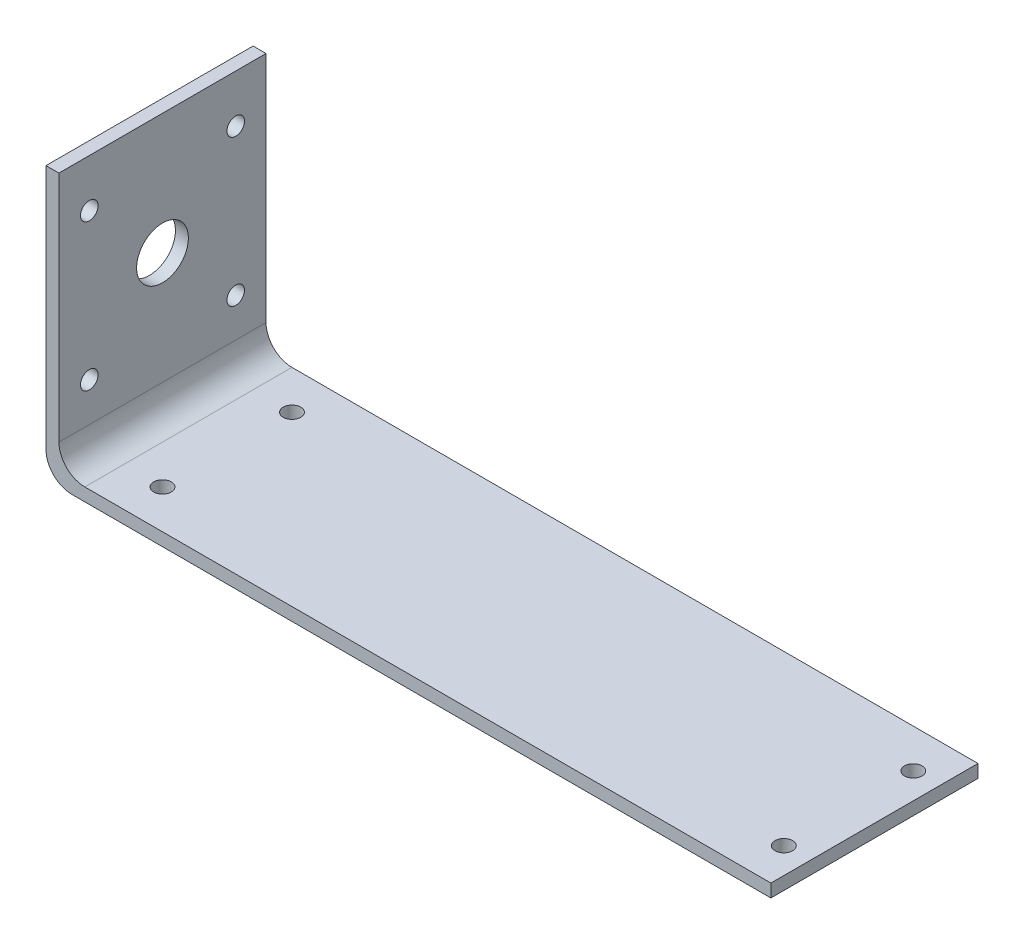
ISO-10303-21;
HEADER;
FILE_DESCRIPTION(('STEP AP214'),'2;1');
FILE_NAME('part.step','',(''),(''),'','','');
FILE_SCHEMA(('AUTOMOTIVE_DESIGN { 1 0 10303 214 1 1 1 1 }'));
ENDSEC;
DATA;
#1=APPLICATION_CONTEXT('core data for automotive mechanical design processes');
#2=APPLICATION_PROTOCOL_DEFINITION('international standard','automotive_design',2000,#1);
#3=PRODUCT_CONTEXT('',#1,'mechanical');
#4=PRODUCT('Part','Part','',(#3));
#5=PRODUCT_RELATED_PRODUCT_CATEGORY('part','',(#4));
#6=PRODUCT_DEFINITION_FORMATION('','',#4);
#7=PRODUCT_DEFINITION_CONTEXT('part definition',#1,'design');
#8=PRODUCT_DEFINITION('design','',#6,#7);
#9=PRODUCT_DEFINITION_SHAPE('','',#8);
#10=(LENGTH_UNIT() NAMED_UNIT(*) SI_UNIT(.MILLI.,.METRE.));
#11=(NAMED_UNIT(*) PLANE_ANGLE_UNIT() SI_UNIT($,.RADIAN.));
#12=(NAMED_UNIT(*) SI_UNIT($,.STERADIAN.) SOLID_ANGLE_UNIT());
#13=UNCERTAINTY_MEASURE_WITH_UNIT(LENGTH_MEASURE(1.E-05),#10,'distance_accuracy_value','');
#14=(GEOMETRIC_REPRESENTATION_CONTEXT(3) GLOBAL_UNCERTAINTY_ASSIGNED_CONTEXT((#13)) GLOBAL_UNIT_ASSIGNED_CONTEXT((#10,
#11,#12)) REPRESENTATION_CONTEXT('',''));
#15=CARTESIAN_POINT('',(0.,0.,0.));
#16=DIRECTION('',(0.,0.,1.));
#17=DIRECTION('',(1.,0.,0.));
#18=AXIS2_PLACEMENT_3D('',#15,#16,#17);
#19=CARTESIAN_POINT('',(0.,0.,0.));
#20=DIRECTION('',(0.,-1.,0.));
#21=DIRECTION('',(0.,0.,-1.));
#22=AXIS2_PLACEMENT_3D('',#19,#20,#21);
#23=PLANE('',#22);
#24=DIRECTION('',(1.,0.,0.));
#25=VECTOR('',#24,1.);
#26=CARTESIAN_POINT('',(-88.9,0.,25.4));
#27=LINE('',#26,#25);
#28=CARTESIAN_POINT('',(-82.55,0.,25.4));
#29=VERTEX_POINT('',#28);
#30=CARTESIAN_POINT('',(88.9,0.,25.4));
#31=VERTEX_POINT('',#30);
#32=EDGE_CURVE('E140',#29,#31,#27,.T.);
#33=ORIENTED_EDGE('',*,*,#32,.F.);
#34=DIRECTION('',(0.,0.,1.));
#35=VECTOR('',#34,1.);
#36=CARTESIAN_POINT('',(-82.55,0.,-25.4));
#37=LINE('',#36,#35);
#38=CARTESIAN_POINT('',(-82.55,0.,-25.4));
#39=VERTEX_POINT('',#38);
#40=EDGE_CURVE('E159',#29,#39,#37,.F.);
#41=ORIENTED_EDGE('',*,*,#40,.T.);
#42=DIRECTION('',(-1.,0.,0.));
#43=VECTOR('',#42,1.);
#44=CARTESIAN_POINT('',(-88.9,0.,-25.4));
#45=LINE('',#44,#43);
#46=CARTESIAN_POINT('',(88.9,0.,-25.4));
#47=VERTEX_POINT('',#46);
#48=EDGE_CURVE('E146',#47,#39,#45,.T.);
#49=ORIENTED_EDGE('',*,*,#48,.F.);
#50=DIRECTION('',(0.,0.,-1.));
#51=VECTOR('',#50,1.);
#52=CARTESIAN_POINT('',(88.9,0.,25.4));
#53=LINE('',#52,#51);
#54=EDGE_CURVE('E135',#31,#47,#53,.T.);
#55=ORIENTED_EDGE('',*,*,#54,.F.);
#56=EDGE_LOOP('',(#33,#41,#49,#55));
#57=FACE_BOUND('',#56,.T.);
#58=CARTESIAN_POINT('',(-69.85,0.,15.875));
#59=DIRECTION('',(0.,1.,0.));
#60=DIRECTION('',(0.,0.,1.));
#61=AXIS2_PLACEMENT_3D('',#58,#59,#60);
#62=CIRCLE('',#61,2.15899999999999);
#63=CARTESIAN_POINT('',(-69.85,0.,18.034));
#64=VERTEX_POINT('',#63);
#65=EDGE_CURVE('E277',#64,#64,#62,.T.);
#66=ORIENTED_EDGE('',*,*,#65,.T.);
#67=EDGE_LOOP('',(#66));
#68=FACE_BOUND('',#67,.T.);
#69=CARTESIAN_POINT('',(-69.85,0.,-15.875));
#70=DIRECTION('',(0.,1.,0.));
#71=DIRECTION('',(0.,0.,1.));
#72=AXIS2_PLACEMENT_3D('',#69,#70,#71);
#73=CIRCLE('',#72,2.15899999999999);
#74=CARTESIAN_POINT('',(-69.85,0.,-13.716));
#75=VERTEX_POINT('',#74);
#76=EDGE_CURVE('E271',#75,#75,#73,.T.);
#77=ORIENTED_EDGE('',*,*,#76,.T.);
#78=EDGE_LOOP('',(#77));
#79=FACE_BOUND('',#78,.T.);
#80=CARTESIAN_POINT('',(82.55,0.,-15.875));
#81=DIRECTION('',(0.,1.,0.));
#82=DIRECTION('',(0.,0.,1.));
#83=AXIS2_PLACEMENT_3D('',#80,#81,#82);
#84=CIRCLE('',#83,2.15899999999999);
#85=CARTESIAN_POINT('',(82.55,0.,-13.716));
#86=VERTEX_POINT('',#85);
#87=EDGE_CURVE('E262',#86,#86,#84,.T.);
#88=ORIENTED_EDGE('',*,*,#87,.T.);
#89=EDGE_LOOP('',(#88));
#90=FACE_BOUND('',#89,.T.);
#91=CARTESIAN_POINT('',(82.55,0.,15.875));
#92=DIRECTION('',(0.,1.,0.));
#93=DIRECTION('',(0.,0.,1.));
#94=AXIS2_PLACEMENT_3D('',#91,#92,#93);
#95=CIRCLE('',#94,2.15899999999999);
#96=CARTESIAN_POINT('',(82.55,0.,18.034));
#97=VERTEX_POINT('',#96);
#98=EDGE_CURVE('E258',#97,#97,#95,.T.);
#99=ORIENTED_EDGE('',*,*,#98,.T.);
#100=EDGE_LOOP('',(#99));
#101=FACE_BOUND('',#100,.T.);
#102=ADVANCED_FACE('F32',(#57,#68,#79,#90,#101),#23,.T.);
#103=CARTESIAN_POINT('',(-88.9,3.175,25.4));
#104=DIRECTION('',(1.,0.,0.));
#105=DIRECTION('',(0.,0.,-1.));
#106=AXIS2_PLACEMENT_3D('',#103,#104,#105);
#107=PLANE('',#106);
#108=CARTESIAN_POINT('',(-88.9,37.0105122421383,3.01383015766099E-08));
#109=DIRECTION('',(-1.,0.,0.));
#110=DIRECTION('',(0.,0.,1.));
#111=AXIS2_PLACEMENT_3D('',#108,#109,#110);
#112=CIRCLE('',#111,6.34999999999997);
#113=CARTESIAN_POINT('',(-88.9,37.0105122421383,6.35000003013828));
#114=VERTEX_POINT('',#113);
#115=EDGE_CURVE('E283',#114,#114,#112,.T.);
#116=ORIENTED_EDGE('',*,*,#115,.F.);
#117=EDGE_LOOP('',(#116));
#118=FACE_BOUND('',#117,.T.);
#119=CARTESIAN_POINT('',(-88.9,54.9710244842767,-17.960512212));
#120=DIRECTION('',(-1.,0.,0.));
#121=DIRECTION('',(0.,0.,1.));
#122=AXIS2_PLACEMENT_3D('',#119,#120,#121);
#123=CIRCLE('',#122,2.15899999999997);
#124=CARTESIAN_POINT('',(-88.9,54.9710244842767,-15.801512212));
#125=VERTEX_POINT('',#124);
#126=EDGE_CURVE('E288',#125,#125,#123,.T.);
#127=ORIENTED_EDGE('',*,*,#126,.F.);
#128=EDGE_LOOP('',(#127));
#129=FACE_BOUND('',#128,.T.);
#130=CARTESIAN_POINT('',(-88.9,54.9710244842766,17.9605122722766));
#131=DIRECTION('',(-1.,0.,0.));
#132=DIRECTION('',(0.,0.,1.));
#133=AXIS2_PLACEMENT_3D('',#130,#131,#132);
#134=CIRCLE('',#133,2.15899999999997);
#135=CARTESIAN_POINT('',(-88.9,54.9710244842766,20.1195122722766));
#136=VERTEX_POINT('',#135);
#137=EDGE_CURVE('E291',#136,#136,#134,.T.);
#138=ORIENTED_EDGE('',*,*,#137,.F.);
#139=EDGE_LOOP('',(#138));
#140=FACE_BOUND('',#139,.T.);
#141=CARTESIAN_POINT('',(-88.9,19.05,-17.960512212));
#142=DIRECTION('',(-1.,0.,0.));
#143=DIRECTION('',(0.,0.,1.));
#144=AXIS2_PLACEMENT_3D('',#141,#142,#143);
#145=CIRCLE('',#144,2.15899999999997);
#146=CARTESIAN_POINT('',(-88.9,19.05,-15.801512212));
#147=VERTEX_POINT('',#146);
#148=EDGE_CURVE('E126',#147,#147,#145,.T.);
#149=ORIENTED_EDGE('',*,*,#148,.F.);
#150=EDGE_LOOP('',(#149));
#151=FACE_BOUND('',#150,.T.);
#152=DIRECTION('',(0.,-1.,0.));
#153=VECTOR('',#152,1.);
#154=CARTESIAN_POINT('',(-88.9,3.175,-25.4));
#155=LINE('',#154,#153);
#156=CARTESIAN_POINT('',(-88.9,66.675,-25.4));
#157=VERTEX_POINT('',#156);
#158=CARTESIAN_POINT('',(-88.9,6.35,-25.4));
#159=VERTEX_POINT('',#158);
#160=EDGE_CURVE('E107',#157,#159,#155,.T.);
#161=ORIENTED_EDGE('',*,*,#160,.T.);
#162=DIRECTION('',(0.,0.,1.));
#163=VECTOR('',#162,1.);
#164=CARTESIAN_POINT('',(-88.9,6.35,25.4));
#165=LINE('',#164,#163);
#166=CARTESIAN_POINT('',(-88.9,6.35,25.4));
#167=VERTEX_POINT('',#166);
#168=EDGE_CURVE('E105',#159,#167,#165,.T.);
#169=ORIENTED_EDGE('',*,*,#168,.T.);
#170=DIRECTION('',(0.,-1.,0.));
#171=VECTOR('',#170,1.);
#172=CARTESIAN_POINT('',(-88.9,3.175,25.4));
#173=LINE('',#172,#171);
#174=CARTESIAN_POINT('',(-88.9,66.675,25.4));
#175=VERTEX_POINT('',#174);
#176=EDGE_CURVE('E97',#175,#167,#173,.T.);
#177=ORIENTED_EDGE('',*,*,#176,.F.);
#178=DIRECTION('',(0.,0.,1.));
#179=VECTOR('',#178,1.);
#180=CARTESIAN_POINT('',(-88.9,66.675,-25.4));
#181=LINE('',#180,#179);
#182=EDGE_CURVE('E103',#157,#175,#181,.T.);
#183=ORIENTED_EDGE('',*,*,#182,.F.);
#184=EDGE_LOOP('',(#161,#169,#177,#183));
#185=FACE_BOUND('',#184,.T.);
#186=CARTESIAN_POINT('',(-88.9,19.05,17.9605122722766));
#187=DIRECTION('',(-1.,0.,0.));
#188=DIRECTION('',(0.,0.,1.));
#189=AXIS2_PLACEMENT_3D('',#186,#187,#188);
#190=CIRCLE('',#189,2.15899999999997);
#191=CARTESIAN_POINT('',(-88.9,19.05,20.1195122722766));
#192=VERTEX_POINT('',#191);
#193=EDGE_CURVE('E297',#192,#192,#190,.T.);
#194=ORIENTED_EDGE('',*,*,#193,.F.);
#195=EDGE_LOOP('',(#194));
#196=FACE_BOUND('',#195,.T.);
#197=ADVANCED_FACE('F100',(#118,#129,#140,#151,#185,#196),#107,.F.);
#198=CARTESIAN_POINT('',(0.,3.175,0.));
#199=DIRECTION('',(0.,-1.,0.));
#200=DIRECTION('',(0.,0.,-1.));
#201=AXIS2_PLACEMENT_3D('',#198,#199,#200);
#202=PLANE('',#201);
#203=CARTESIAN_POINT('',(82.55,3.175,15.875));
#204=DIRECTION('',(0.,1.,0.));
#205=DIRECTION('',(0.,0.,1.));
#206=AXIS2_PLACEMENT_3D('',#203,#204,#205);
#207=CIRCLE('',#206,2.15899999999999);
#208=CARTESIAN_POINT('',(82.55,3.175,18.034));
#209=VERTEX_POINT('',#208);
#210=EDGE_CURVE('E261',#209,#209,#207,.T.);
#211=ORIENTED_EDGE('',*,*,#210,.F.);
#212=EDGE_LOOP('',(#211));
#213=FACE_BOUND('',#212,.T.);
#214=CARTESIAN_POINT('',(82.55,3.175,-15.875));
#215=DIRECTION('',(0.,1.,0.));
#216=DIRECTION('',(0.,0.,1.));
#217=AXIS2_PLACEMENT_3D('',#214,#215,#216);
#218=CIRCLE('',#217,2.15899999999999);
#219=CARTESIAN_POINT('',(82.55,3.175,-13.716));
#220=VERTEX_POINT('',#219);
#221=EDGE_CURVE('E265',#220,#220,#218,.T.);
#222=ORIENTED_EDGE('',*,*,#221,.F.);
#223=EDGE_LOOP('',(#222));
#224=FACE_BOUND('',#223,.T.);
#225=CARTESIAN_POINT('',(-69.85,3.175,-15.875));
#226=DIRECTION('',(0.,1.,0.));
#227=DIRECTION('',(0.,0.,1.));
#228=AXIS2_PLACEMENT_3D('',#225,#226,#227);
#229=CIRCLE('',#228,2.15899999999999);
#230=CARTESIAN_POINT('',(-69.85,3.175,-13.716));
#231=VERTEX_POINT('',#230);
#232=EDGE_CURVE('E274',#231,#231,#229,.T.);
#233=ORIENTED_EDGE('',*,*,#232,.F.);
#234=EDGE_LOOP('',(#233));
#235=FACE_BOUND('',#234,.T.);
#236=CARTESIAN_POINT('',(-69.85,3.175,15.875));
#237=DIRECTION('',(0.,1.,0.));
#238=DIRECTION('',(0.,0.,1.));
#239=AXIS2_PLACEMENT_3D('',#236,#237,#238);
#240=CIRCLE('',#239,2.15899999999999);
#241=CARTESIAN_POINT('',(-69.85,3.175,18.034));
#242=VERTEX_POINT('',#241);
#243=EDGE_CURVE('E280',#242,#242,#240,.T.);
#244=ORIENTED_EDGE('',*,*,#243,.F.);
#245=EDGE_LOOP('',(#244));
#246=FACE_BOUND('',#245,.T.);
#247=DIRECTION('',(-1.,0.,0.));
#248=VECTOR('',#247,1.);
#249=CARTESIAN_POINT('',(-88.9,3.175,-25.4));
#250=LINE('',#249,#248);
#251=CARTESIAN_POINT('',(88.9,3.175,-25.4));
#252=VERTEX_POINT('',#251);
#253=CARTESIAN_POINT('',(-79.375,3.175,-25.4));
#254=VERTEX_POINT('',#253);
#255=EDGE_CURVE('E139',#252,#254,#250,.T.);
#256=ORIENTED_EDGE('',*,*,#255,.T.);
#257=DIRECTION('',(0.,0.,-1.));
#258=VECTOR('',#257,1.);
#259=CARTESIAN_POINT('',(-79.375,3.175,25.4));
#260=LINE('',#259,#258);
#261=CARTESIAN_POINT('',(-79.375,3.175,25.4));
#262=VERTEX_POINT('',#261);
#263=EDGE_CURVE('E165',#254,#262,#260,.F.);
#264=ORIENTED_EDGE('',*,*,#263,.T.);
#265=DIRECTION('',(1.,0.,0.));
#266=VECTOR('',#265,1.);
#267=CARTESIAN_POINT('',(-88.9,3.175,25.4));
#268=LINE('',#267,#266);
#269=CARTESIAN_POINT('',(88.9,3.175,25.4));
#270=VERTEX_POINT('',#269);
#271=EDGE_CURVE('E142',#262,#270,#268,.T.);
#272=ORIENTED_EDGE('',*,*,#271,.T.);
#273=DIRECTION('',(0.,0.,-1.));
#274=VECTOR('',#273,1.);
#275=CARTESIAN_POINT('',(88.9,3.175,25.4));
#276=LINE('',#275,#274);
#277=EDGE_CURVE('E136',#270,#252,#276,.T.);
#278=ORIENTED_EDGE('',*,*,#277,.T.);
#279=EDGE_LOOP('',(#256,#264,#272,#278));
#280=FACE_BOUND('',#279,.T.);
#281=ADVANCED_FACE('F169',(#213,#224,#235,#246,#280),#202,.F.);
#282=CARTESIAN_POINT('',(88.9,3.175,25.4));
#283=DIRECTION('',(-1.,0.,0.));
#284=DIRECTION('',(0.,0.,1.));
#285=AXIS2_PLACEMENT_3D('',#282,#283,#284);
#286=PLANE('',#285);
#287=ORIENTED_EDGE('',*,*,#54,.T.);
#288=DIRECTION('',(0.,-1.,0.));
#289=VECTOR('',#288,1.);
#290=CARTESIAN_POINT('',(88.9,3.175,-25.4));
#291=LINE('',#290,#289);
#292=EDGE_CURVE('E153',#252,#47,#291,.T.);
#293=ORIENTED_EDGE('',*,*,#292,.F.);
#294=ORIENTED_EDGE('',*,*,#277,.F.);
#295=DIRECTION('',(0.,-1.,0.));
#296=VECTOR('',#295,1.);
#297=CARTESIAN_POINT('',(88.9,3.175,25.4));
#298=LINE('',#297,#296);
#299=EDGE_CURVE('E108',#270,#31,#298,.T.);
#300=ORIENTED_EDGE('',*,*,#299,.T.);
#301=EDGE_LOOP('',(#287,#293,#294,#300));
#302=FACE_BOUND('',#301,.T.);
#303=ADVANCED_FACE('F187',(#302),#286,.F.);
#304=CARTESIAN_POINT('',(-88.9,3.175,-25.4));
#305=DIRECTION('',(0.,0.,1.));
#306=DIRECTION('',(1.,0.,0.));
#307=AXIS2_PLACEMENT_3D('',#304,#305,#306);
#308=PLANE('',#307);
#309=ORIENTED_EDGE('',*,*,#48,.T.);
#310=CARTESIAN_POINT('',(-82.55,6.35,-25.4));
#311=DIRECTION('',(0.,0.,1.));
#312=DIRECTION('',(1.,0.,0.));
#313=AXIS2_PLACEMENT_3D('',#310,#311,#312);
#314=CIRCLE('',#313,6.35);
#315=EDGE_CURVE('E161',#39,#159,#314,.F.);
#316=ORIENTED_EDGE('',*,*,#315,.T.);
#317=ORIENTED_EDGE('',*,*,#160,.F.);
#318=DIRECTION('',(-1.,0.,0.));
#319=VECTOR('',#318,1.);
#320=CARTESIAN_POINT('',(-88.9,66.675,-25.4));
#321=LINE('',#320,#319);
#322=CARTESIAN_POINT('',(-85.725,66.675,-25.4));
#323=VERTEX_POINT('',#322);
#324=EDGE_CURVE('E122',#323,#157,#321,.T.);
#325=ORIENTED_EDGE('',*,*,#324,.F.);
#326=DIRECTION('',(0.,-1.,0.));
#327=VECTOR('',#326,1.);
#328=CARTESIAN_POINT('',(-85.725,66.675,-25.4));
#329=LINE('',#328,#327);
#330=CARTESIAN_POINT('',(-85.725,9.525,-25.4));
#331=VERTEX_POINT('',#330);
#332=EDGE_CURVE('E132',#323,#331,#329,.T.);
#333=ORIENTED_EDGE('',*,*,#332,.T.);
#334=CARTESIAN_POINT('',(-79.375,9.525,-25.4));
#335=DIRECTION('',(0.,0.,1.));
#336=DIRECTION('',(1.,0.,0.));
#337=AXIS2_PLACEMENT_3D('',#334,#335,#336);
#338=CIRCLE('',#337,6.35);
#339=EDGE_CURVE('E41',#331,#254,#338,.T.);
#340=ORIENTED_EDGE('',*,*,#339,.T.);
#341=ORIENTED_EDGE('',*,*,#255,.F.);
#342=ORIENTED_EDGE('',*,*,#292,.T.);
#343=EDGE_LOOP('',(#309,#316,#317,#325,#333,#340,#341,#342));
#344=FACE_BOUND('',#343,.T.);
#345=ADVANCED_FACE('F176',(#344),#308,.F.);
#346=CARTESIAN_POINT('',(-88.9,3.175,25.4));
#347=DIRECTION('',(0.,0.,-1.));
#348=DIRECTION('',(-1.,0.,0.));
#349=AXIS2_PLACEMENT_3D('',#346,#347,#348);
#350=PLANE('',#349);
#351=ORIENTED_EDGE('',*,*,#176,.T.);
#352=CARTESIAN_POINT('',(-82.55,6.35,25.4));
#353=DIRECTION('',(0.,0.,-1.));
#354=DIRECTION('',(-1.,0.,0.));
#355=AXIS2_PLACEMENT_3D('',#352,#353,#354);
#356=CIRCLE('',#355,6.35);
#357=EDGE_CURVE('E157',#167,#29,#356,.F.);
#358=ORIENTED_EDGE('',*,*,#357,.T.);
#359=ORIENTED_EDGE('',*,*,#32,.T.);
#360=ORIENTED_EDGE('',*,*,#299,.F.);
#361=ORIENTED_EDGE('',*,*,#271,.F.);
#362=CARTESIAN_POINT('',(-79.375,9.525,25.4));
#363=DIRECTION('',(0.,0.,-1.));
#364=DIRECTION('',(-1.,0.,0.));
#365=AXIS2_PLACEMENT_3D('',#362,#363,#364);
#366=CIRCLE('',#365,6.35);
#367=CARTESIAN_POINT('',(-85.725,9.525,25.4));
#368=VERTEX_POINT('',#367);
#369=EDGE_CURVE('E11',#262,#368,#366,.T.);
#370=ORIENTED_EDGE('',*,*,#369,.T.);
#371=DIRECTION('',(0.,-1.,0.));
#372=VECTOR('',#371,1.);
#373=CARTESIAN_POINT('',(-85.725,66.675,25.4));
#374=LINE('',#373,#372);
#375=CARTESIAN_POINT('',(-85.725,66.675,25.4));
#376=VERTEX_POINT('',#375);
#377=EDGE_CURVE('E114',#376,#368,#374,.T.);
#378=ORIENTED_EDGE('',*,*,#377,.F.);
#379=DIRECTION('',(1.,0.,0.));
#380=VECTOR('',#379,1.);
#381=CARTESIAN_POINT('',(-88.9,66.675,25.4));
#382=LINE('',#381,#380);
#383=EDGE_CURVE('E111',#175,#376,#382,.T.);
#384=ORIENTED_EDGE('',*,*,#383,.F.);
#385=EDGE_LOOP('',(#351,#358,#359,#360,#361,#370,#378,#384));
#386=FACE_BOUND('',#385,.T.);
#387=ADVANCED_FACE('F112',(#386),#350,.F.);
#388=CARTESIAN_POINT('',(-85.725,66.675,-25.4));
#389=DIRECTION('',(-1.,0.,0.));
#390=DIRECTION('',(0.,0.,1.));
#391=AXIS2_PLACEMENT_3D('',#388,#389,#390);
#392=PLANE('',#391);
#393=CARTESIAN_POINT('',(-85.725,37.0105122421383,3.01383015766099E-08));
#394=DIRECTION('',(-1.,0.,0.));
#395=DIRECTION('',(0.,0.,1.));
#396=AXIS2_PLACEMENT_3D('',#393,#394,#395);
#397=CIRCLE('',#396,6.34999999999996);
#398=CARTESIAN_POINT('',(-85.725,37.0105122421383,6.35000003013826));
#399=VERTEX_POINT('',#398);
#400=EDGE_CURVE('E286',#399,#399,#397,.T.);
#401=ORIENTED_EDGE('',*,*,#400,.T.);
#402=EDGE_LOOP('',(#401));
#403=FACE_BOUND('',#402,.T.);
#404=CARTESIAN_POINT('',(-85.725,54.9710244842767,-17.960512212));
#405=DIRECTION('',(-1.,0.,0.));
#406=DIRECTION('',(0.,0.,1.));
#407=AXIS2_PLACEMENT_3D('',#404,#405,#406);
#408=CIRCLE('',#407,2.15899999999996);
#409=CARTESIAN_POINT('',(-85.725,54.9710244842767,-15.801512212));
#410=VERTEX_POINT('',#409);
#411=EDGE_CURVE('E36',#410,#410,#408,.T.);
#412=ORIENTED_EDGE('',*,*,#411,.T.);
#413=EDGE_LOOP('',(#412));
#414=FACE_BOUND('',#413,.T.);
#415=CARTESIAN_POINT('',(-85.725,54.9710244842766,17.9605122722766));
#416=DIRECTION('',(-1.,0.,0.));
#417=DIRECTION('',(0.,0.,1.));
#418=AXIS2_PLACEMENT_3D('',#415,#416,#417);
#419=CIRCLE('',#418,2.15899999999996);
#420=CARTESIAN_POINT('',(-85.725,54.9710244842766,20.1195122722766));
#421=VERTEX_POINT('',#420);
#422=EDGE_CURVE('E294',#421,#421,#419,.T.);
#423=ORIENTED_EDGE('',*,*,#422,.T.);
#424=EDGE_LOOP('',(#423));
#425=FACE_BOUND('',#424,.T.);
#426=CARTESIAN_POINT('',(-85.725,19.05,17.9605122722766));
#427=DIRECTION('',(-1.,0.,0.));
#428=DIRECTION('',(0.,0.,1.));
#429=AXIS2_PLACEMENT_3D('',#426,#427,#428);
#430=CIRCLE('',#429,2.15899999999996);
#431=CARTESIAN_POINT('',(-85.725,19.05,20.1195122722766));
#432=VERTEX_POINT('',#431);
#433=EDGE_CURVE('E300',#432,#432,#430,.T.);
#434=ORIENTED_EDGE('',*,*,#433,.T.);
#435=EDGE_LOOP('',(#434));
#436=FACE_BOUND('',#435,.T.);
#437=CARTESIAN_POINT('',(-85.725,19.05,-17.960512212));
#438=DIRECTION('',(-1.,0.,0.));
#439=DIRECTION('',(0.,0.,1.));
#440=AXIS2_PLACEMENT_3D('',#437,#438,#439);
#441=CIRCLE('',#440,2.15899999999996);
#442=CARTESIAN_POINT('',(-85.725,19.05,-15.801512212));
#443=VERTEX_POINT('',#442);
#444=EDGE_CURVE('E123',#443,#443,#441,.T.);
#445=ORIENTED_EDGE('',*,*,#444,.T.);
#446=EDGE_LOOP('',(#445));
#447=FACE_BOUND('',#446,.T.);
#448=ORIENTED_EDGE('',*,*,#377,.T.);
#449=DIRECTION('',(0.,0.,-1.));
#450=VECTOR('',#449,1.);
#451=CARTESIAN_POINT('',(-85.725,9.525,-25.4));
#452=LINE('',#451,#450);
#453=EDGE_CURVE('E163',#368,#331,#452,.T.);
#454=ORIENTED_EDGE('',*,*,#453,.T.);
#455=ORIENTED_EDGE('',*,*,#332,.F.);
#456=DIRECTION('',(0.,0.,-1.));
#457=VECTOR('',#456,1.);
#458=CARTESIAN_POINT('',(-85.725,66.675,-25.4));
#459=LINE('',#458,#457);
#460=EDGE_CURVE('E117',#376,#323,#459,.T.);
#461=ORIENTED_EDGE('',*,*,#460,.F.);
#462=EDGE_LOOP('',(#448,#454,#455,#461));
#463=FACE_BOUND('',#462,.T.);
#464=ADVANCED_FACE('F175',(#403,#414,#425,#436,#447,#463),#392,.F.);
#465=CARTESIAN_POINT('',(0.,66.675,0.));
#466=DIRECTION('',(0.,1.,0.));
#467=DIRECTION('',(0.,0.,1.));
#468=AXIS2_PLACEMENT_3D('',#465,#466,#467);
#469=PLANE('',#468);
#470=ORIENTED_EDGE('',*,*,#182,.T.);
#471=ORIENTED_EDGE('',*,*,#383,.T.);
#472=ORIENTED_EDGE('',*,*,#460,.T.);
#473=ORIENTED_EDGE('',*,*,#324,.T.);
#474=EDGE_LOOP('',(#470,#471,#472,#473));
#475=FACE_BOUND('',#474,.T.);
#476=ADVANCED_FACE('F120',(#475),#469,.T.);
#477=CARTESIAN_POINT('',(-82.55,6.35,25.4));
#478=DIRECTION('',(0.,0.,-1.));
#479=DIRECTION('',(-1.,0.,0.));
#480=AXIS2_PLACEMENT_3D('',#477,#478,#479);
#481=CYLINDRICAL_SURFACE('',#480,6.35);
#482=ORIENTED_EDGE('',*,*,#315,.F.);
#483=ORIENTED_EDGE('',*,*,#40,.F.);
#484=ORIENTED_EDGE('',*,*,#357,.F.);
#485=ORIENTED_EDGE('',*,*,#168,.F.);
#486=EDGE_LOOP('',(#482,#483,#484,#485));
#487=FACE_BOUND('',#486,.T.);
#488=ADVANCED_FACE('F179',(#487),#481,.T.);
#489=CARTESIAN_POINT('',(-79.375,9.525,-25.4));
#490=DIRECTION('',(0.,0.,1.));
#491=DIRECTION('',(1.,0.,0.));
#492=AXIS2_PLACEMENT_3D('',#489,#490,#491);
#493=CYLINDRICAL_SURFACE('',#492,6.35);
#494=ORIENTED_EDGE('',*,*,#369,.F.);
#495=ORIENTED_EDGE('',*,*,#263,.F.);
#496=ORIENTED_EDGE('',*,*,#339,.F.);
#497=ORIENTED_EDGE('',*,*,#453,.F.);
#498=EDGE_LOOP('',(#494,#495,#496,#497));
#499=FACE_BOUND('',#498,.T.);
#500=ADVANCED_FACE('F34',(#499),#493,.F.);
#501=CARTESIAN_POINT('',(-88.9,19.05,-17.960512212));
#502=DIRECTION('',(-1.,0.,0.));
#503=DIRECTION('',(0.,0.,1.));
#504=AXIS2_PLACEMENT_3D('',#501,#502,#503);
#505=CYLINDRICAL_SURFACE('',#504,2.15899999999996);
#506=ORIENTED_EDGE('',*,*,#148,.T.);
#507=EDGE_LOOP('',(#506));
#508=FACE_BOUND('',#507,.T.);
#509=ORIENTED_EDGE('',*,*,#444,.F.);
#510=EDGE_LOOP('',(#509));
#511=FACE_BOUND('',#510,.T.);
#512=ADVANCED_FACE('F218',(#508,#511),#505,.F.);
#513=CARTESIAN_POINT('',(-88.9,19.05,17.9605122722766));
#514=DIRECTION('',(-1.,0.,0.));
#515=DIRECTION('',(0.,0.,1.));
#516=AXIS2_PLACEMENT_3D('',#513,#514,#515);
#517=CYLINDRICAL_SURFACE('',#516,2.15899999999996);
#518=ORIENTED_EDGE('',*,*,#193,.T.);
#519=EDGE_LOOP('',(#518));
#520=FACE_BOUND('',#519,.T.);
#521=ORIENTED_EDGE('',*,*,#433,.F.);
#522=EDGE_LOOP('',(#521));
#523=FACE_BOUND('',#522,.T.);
#524=ADVANCED_FACE('F221',(#520,#523),#517,.F.);
#525=CARTESIAN_POINT('',(-88.9,54.9710244842766,17.9605122722766));
#526=DIRECTION('',(-1.,0.,0.));
#527=DIRECTION('',(0.,0.,1.));
#528=AXIS2_PLACEMENT_3D('',#525,#526,#527);
#529=CYLINDRICAL_SURFACE('',#528,2.15899999999996);
#530=ORIENTED_EDGE('',*,*,#137,.T.);
#531=EDGE_LOOP('',(#530));
#532=FACE_BOUND('',#531,.T.);
#533=ORIENTED_EDGE('',*,*,#422,.F.);
#534=EDGE_LOOP('',(#533));
#535=FACE_BOUND('',#534,.T.);
#536=ADVANCED_FACE('F225',(#532,#535),#529,.F.);
#537=CARTESIAN_POINT('',(-88.9,54.9710244842767,-17.960512212));
#538=DIRECTION('',(-1.,0.,0.));
#539=DIRECTION('',(0.,0.,1.));
#540=AXIS2_PLACEMENT_3D('',#537,#538,#539);
#541=CYLINDRICAL_SURFACE('',#540,2.15899999999996);
#542=ORIENTED_EDGE('',*,*,#126,.T.);
#543=EDGE_LOOP('',(#542));
#544=FACE_BOUND('',#543,.T.);
#545=ORIENTED_EDGE('',*,*,#411,.F.);
#546=EDGE_LOOP('',(#545));
#547=FACE_BOUND('',#546,.T.);
#548=ADVANCED_FACE('F229',(#544,#547),#541,.F.);
#549=CARTESIAN_POINT('',(-88.9,37.0105122421383,3.01383015766099E-08));
#550=DIRECTION('',(-1.,0.,0.));
#551=DIRECTION('',(0.,0.,1.));
#552=AXIS2_PLACEMENT_3D('',#549,#550,#551);
#553=CYLINDRICAL_SURFACE('',#552,6.34999999999996);
#554=ORIENTED_EDGE('',*,*,#115,.T.);
#555=EDGE_LOOP('',(#554));
#556=FACE_BOUND('',#555,.T.);
#557=ORIENTED_EDGE('',*,*,#400,.F.);
#558=EDGE_LOOP('',(#557));
#559=FACE_BOUND('',#558,.T.);
#560=ADVANCED_FACE('F233',(#556,#559),#553,.F.);
#561=CARTESIAN_POINT('',(-69.85,3.175,15.875));
#562=DIRECTION('',(0.,1.,0.));
#563=DIRECTION('',(0.,0.,1.));
#564=AXIS2_PLACEMENT_3D('',#561,#562,#563);
#565=CYLINDRICAL_SURFACE('',#564,2.15899999999999);
#566=ORIENTED_EDGE('',*,*,#65,.F.);
#567=EDGE_LOOP('',(#566));
#568=FACE_BOUND('',#567,.T.);
#569=ORIENTED_EDGE('',*,*,#243,.T.);
#570=EDGE_LOOP('',(#569));
#571=FACE_BOUND('',#570,.T.);
#572=ADVANCED_FACE('F237',(#568,#571),#565,.F.);
#573=CARTESIAN_POINT('',(-69.85,3.175,-15.875));
#574=DIRECTION('',(0.,1.,0.));
#575=DIRECTION('',(0.,0.,1.));
#576=AXIS2_PLACEMENT_3D('',#573,#574,#575);
#577=CYLINDRICAL_SURFACE('',#576,2.15899999999999);
#578=ORIENTED_EDGE('',*,*,#76,.F.);
#579=EDGE_LOOP('',(#578));
#580=FACE_BOUND('',#579,.T.);
#581=ORIENTED_EDGE('',*,*,#232,.T.);
#582=EDGE_LOOP('',(#581));
#583=FACE_BOUND('',#582,.T.);
#584=ADVANCED_FACE('F241',(#580,#583),#577,.F.);
#585=CARTESIAN_POINT('',(82.55,3.175,-15.875));
#586=DIRECTION('',(0.,1.,0.));
#587=DIRECTION('',(0.,0.,1.));
#588=AXIS2_PLACEMENT_3D('',#585,#586,#587);
#589=CYLINDRICAL_SURFACE('',#588,2.15899999999999);
#590=ORIENTED_EDGE('',*,*,#87,.F.);
#591=EDGE_LOOP('',(#590));
#592=FACE_BOUND('',#591,.T.);
#593=ORIENTED_EDGE('',*,*,#221,.T.);
#594=EDGE_LOOP('',(#593));
#595=FACE_BOUND('',#594,.T.);
#596=ADVANCED_FACE('F245',(#592,#595),#589,.F.);
#597=CARTESIAN_POINT('',(82.55,3.175,15.875));
#598=DIRECTION('',(0.,1.,0.));
#599=DIRECTION('',(0.,0.,1.));
#600=AXIS2_PLACEMENT_3D('',#597,#598,#599);
#601=CYLINDRICAL_SURFACE('',#600,2.15899999999999);
#602=ORIENTED_EDGE('',*,*,#98,.F.);
#603=EDGE_LOOP('',(#602));
#604=FACE_BOUND('',#603,.T.);
#605=ORIENTED_EDGE('',*,*,#210,.T.);
#606=EDGE_LOOP('',(#605));
#607=FACE_BOUND('',#606,.T.);
#608=ADVANCED_FACE('F249',(#604,#607),#601,.F.);
#609=CLOSED_SHELL('',(#102,#197,#281,#303,#345,#387,#464,#476,#488,#500,#512,#524,#536,#548,
#560,#572,#584,#596,#608));
#610=MANIFOLD_SOLID_BREP('B2',#609);
#611=ADVANCED_BREP_SHAPE_REPRESENTATION('',(#18,#610),#14);
#612=SHAPE_DEFINITION_REPRESENTATION(#9,#611);
ENDSEC;
END-ISO-10303-21;
